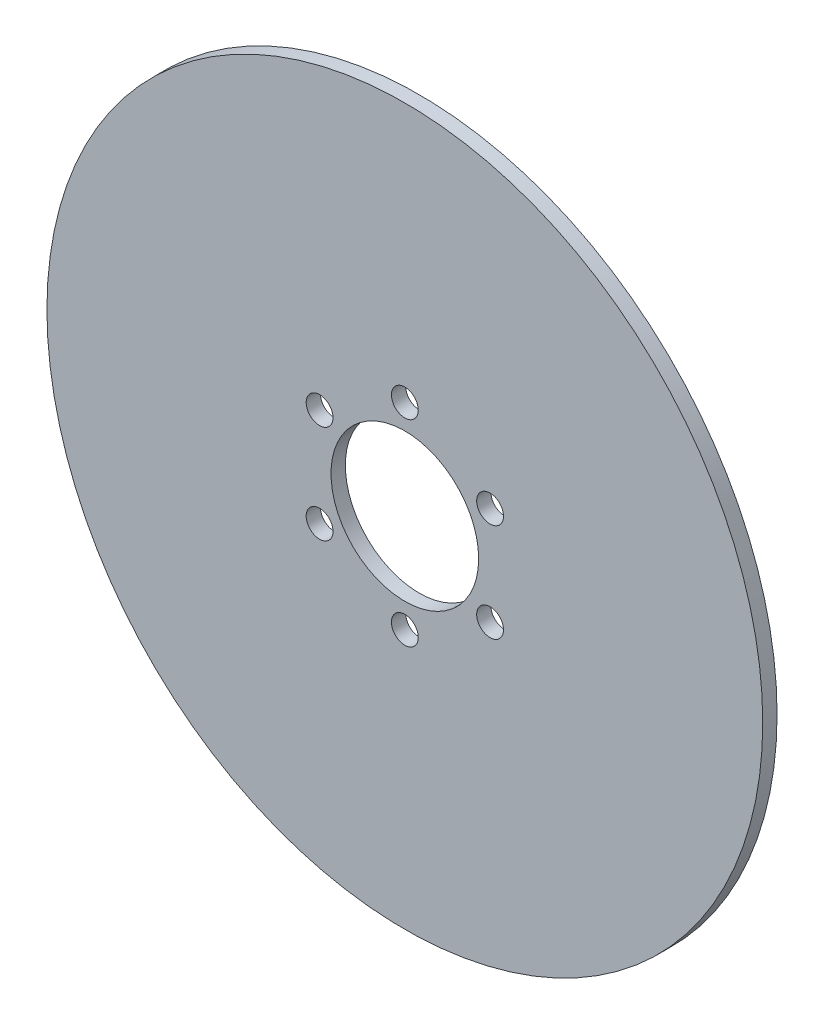
ISO-10303-21;
HEADER;
FILE_DESCRIPTION(('STEP AP214'),'2;1');
FILE_NAME('part.step','',(''),(''),'','','');
FILE_SCHEMA(('AUTOMOTIVE_DESIGN { 1 0 10303 214 1 1 1 1 }'));
ENDSEC;
DATA;
#1=APPLICATION_CONTEXT('core data for automotive mechanical design processes');
#2=APPLICATION_PROTOCOL_DEFINITION('international standard','automotive_design',2000,#1);
#3=PRODUCT_CONTEXT('',#1,'mechanical');
#4=PRODUCT('Part','Part','',(#3));
#5=PRODUCT_RELATED_PRODUCT_CATEGORY('part','',(#4));
#6=PRODUCT_DEFINITION_FORMATION('','',#4);
#7=PRODUCT_DEFINITION_CONTEXT('part definition',#1,'design');
#8=PRODUCT_DEFINITION('design','',#6,#7);
#9=PRODUCT_DEFINITION_SHAPE('','',#8);
#10=(LENGTH_UNIT() NAMED_UNIT(*) SI_UNIT(.MILLI.,.METRE.));
#11=(NAMED_UNIT(*) PLANE_ANGLE_UNIT() SI_UNIT($,.RADIAN.));
#12=(NAMED_UNIT(*) SI_UNIT($,.STERADIAN.) SOLID_ANGLE_UNIT());
#13=UNCERTAINTY_MEASURE_WITH_UNIT(LENGTH_MEASURE(1.E-05),#10,'distance_accuracy_value','');
#14=(GEOMETRIC_REPRESENTATION_CONTEXT(3) GLOBAL_UNCERTAINTY_ASSIGNED_CONTEXT((#13)) GLOBAL_UNIT_ASSIGNED_CONTEXT((#10,
#11,#12)) REPRESENTATION_CONTEXT('',''));
#15=CARTESIAN_POINT('',(0.,0.,0.));
#16=DIRECTION('',(0.,0.,1.));
#17=DIRECTION('',(1.,0.,0.));
#18=AXIS2_PLACEMENT_3D('',#15,#16,#17);
#19=CARTESIAN_POINT('',(0.,68.,3.2));
#20=DIRECTION('',(0.,0.,-1.));
#21=DIRECTION('',(-1.,0.,0.));
#22=AXIS2_PLACEMENT_3D('',#19,#20,#21);
#23=CYLINDRICAL_SURFACE('',#22,10.);
#24=CARTESIAN_POINT('',(0.,68.,0.));
#25=DIRECTION('',(0.,0.,1.));
#26=DIRECTION('',(1.,0.,0.));
#27=AXIS2_PLACEMENT_3D('',#24,#25,#26);
#28=CIRCLE('',#27,10.);
#29=CARTESIAN_POINT('',(10.,68.,0.));
#30=VERTEX_POINT('',#29);
#31=EDGE_CURVE('E85',#30,#30,#28,.T.);
#32=ORIENTED_EDGE('',*,*,#31,.F.);
#33=EDGE_LOOP('',(#32));
#34=FACE_BOUND('',#33,.T.);
#35=CARTESIAN_POINT('',(0.,68.,3.));
#36=DIRECTION('',(0.,0.,1.));
#37=DIRECTION('',(1.,0.,0.));
#38=AXIS2_PLACEMENT_3D('',#35,#36,#37);
#39=CIRCLE('',#38,10.);
#40=CARTESIAN_POINT('',(10.,68.,3.));
#41=VERTEX_POINT('',#40);
#42=EDGE_CURVE('E135',#41,#41,#39,.T.);
#43=ORIENTED_EDGE('',*,*,#42,.T.);
#44=EDGE_LOOP('',(#43));
#45=FACE_BOUND('',#44,.T.);
#46=ADVANCED_FACE('F31',(#34,#45),#23,.F.);
#47=CARTESIAN_POINT('',(26.0224734008266,62.8238082107701,3.2));
#48=DIRECTION('',(0.,0.,-1.));
#49=DIRECTION('',(-1.,0.,0.));
#50=AXIS2_PLACEMENT_3D('',#47,#48,#49);
#51=CYLINDRICAL_SURFACE('',#50,9.99999999999983);
#52=CARTESIAN_POINT('',(26.0224734008266,62.8238082107701,0.));
#53=DIRECTION('',(0.,0.,1.));
#54=DIRECTION('',(1.,0.,0.));
#55=AXIS2_PLACEMENT_3D('',#52,#53,#54);
#56=CIRCLE('',#55,9.99999999999983);
#57=CARTESIAN_POINT('',(36.0224734008264,62.8238082107701,0.));
#58=VERTEX_POINT('',#57);
#59=EDGE_CURVE('E90',#58,#58,#56,.T.);
#60=ORIENTED_EDGE('',*,*,#59,.F.);
#61=EDGE_LOOP('',(#60));
#62=FACE_BOUND('',#61,.T.);
#63=CARTESIAN_POINT('',(26.0224734008266,62.8238082107701,3.));
#64=DIRECTION('',(0.,0.,1.));
#65=DIRECTION('',(1.,0.,0.));
#66=AXIS2_PLACEMENT_3D('',#63,#64,#65);
#67=CIRCLE('',#66,9.99999999999983);
#68=CARTESIAN_POINT('',(36.0224734008264,62.8238082107701,3.));
#69=VERTEX_POINT('',#68);
#70=EDGE_CURVE('E138',#69,#69,#67,.T.);
#71=ORIENTED_EDGE('',*,*,#70,.T.);
#72=EDGE_LOOP('',(#71));
#73=FACE_BOUND('',#72,.T.);
#74=ADVANCED_FACE('F206',(#62,#73),#51,.F.);
#75=CARTESIAN_POINT('',(48.0832611206872,48.08326112069,3.2));
#76=DIRECTION('',(0.,0.,-1.));
#77=DIRECTION('',(-1.,0.,0.));
#78=AXIS2_PLACEMENT_3D('',#75,#76,#77);
#79=CYLINDRICAL_SURFACE('',#78,10.0000000000006);
#80=CARTESIAN_POINT('',(48.0832611206872,48.08326112069,0.));
#81=DIRECTION('',(0.,0.,1.));
#82=DIRECTION('',(1.,0.,0.));
#83=AXIS2_PLACEMENT_3D('',#80,#81,#82);
#84=CIRCLE('',#83,10.0000000000006);
#85=CARTESIAN_POINT('',(58.0832611206878,48.08326112069,0.));
#86=VERTEX_POINT('',#85);
#87=EDGE_CURVE('E93',#86,#86,#84,.T.);
#88=ORIENTED_EDGE('',*,*,#87,.F.);
#89=EDGE_LOOP('',(#88));
#90=FACE_BOUND('',#89,.T.);
#91=CARTESIAN_POINT('',(48.0832611206872,48.08326112069,3.));
#92=DIRECTION('',(0.,0.,1.));
#93=DIRECTION('',(1.,0.,0.));
#94=AXIS2_PLACEMENT_3D('',#91,#92,#93);
#95=CIRCLE('',#94,10.0000000000006);
#96=CARTESIAN_POINT('',(58.0832611206878,48.08326112069,3.));
#97=VERTEX_POINT('',#96);
#98=EDGE_CURVE('E141',#97,#97,#95,.T.);
#99=ORIENTED_EDGE('',*,*,#98,.T.);
#100=EDGE_LOOP('',(#99));
#101=FACE_BOUND('',#100,.T.);
#102=ADVANCED_FACE('F212',(#90,#101),#79,.F.);
#103=CARTESIAN_POINT('',(62.8238082107717,26.0224734008323,3.2));
#104=DIRECTION('',(0.,0.,-1.));
#105=DIRECTION('',(-1.,0.,0.));
#106=AXIS2_PLACEMENT_3D('',#103,#104,#105);
#107=CYLINDRICAL_SURFACE('',#106,10.0000000000023);
#108=CARTESIAN_POINT('',(62.8238082107717,26.0224734008323,0.));
#109=DIRECTION('',(0.,0.,1.));
#110=DIRECTION('',(1.,0.,0.));
#111=AXIS2_PLACEMENT_3D('',#108,#109,#110);
#112=CIRCLE('',#111,10.0000000000023);
#113=CARTESIAN_POINT('',(72.823808210774,26.0224734008323,0.));
#114=VERTEX_POINT('',#113);
#115=EDGE_CURVE('E96',#114,#114,#112,.T.);
#116=ORIENTED_EDGE('',*,*,#115,.F.);
#117=EDGE_LOOP('',(#116));
#118=FACE_BOUND('',#117,.T.);
#119=CARTESIAN_POINT('',(62.8238082107717,26.0224734008323,3.));
#120=DIRECTION('',(0.,0.,1.));
#121=DIRECTION('',(1.,0.,0.));
#122=AXIS2_PLACEMENT_3D('',#119,#120,#121);
#123=CIRCLE('',#122,10.0000000000023);
#124=CARTESIAN_POINT('',(72.823808210774,26.0224734008323,3.));
#125=VERTEX_POINT('',#124);
#126=EDGE_CURVE('E144',#125,#125,#123,.T.);
#127=ORIENTED_EDGE('',*,*,#126,.T.);
#128=EDGE_LOOP('',(#127));
#129=FACE_BOUND('',#128,.T.);
#130=ADVANCED_FACE('F345',(#118,#129),#107,.F.);
#131=CARTESIAN_POINT('',(68.0000000000068,6.75603924620195E-12,3.2));
#132=DIRECTION('',(0.,0.,-1.));
#133=DIRECTION('',(-1.,0.,0.));
#134=AXIS2_PLACEMENT_3D('',#131,#132,#133);
#135=CYLINDRICAL_SURFACE('',#134,10.0000000000047);
#136=CARTESIAN_POINT('',(68.0000000000068,6.75603924620195E-12,0.));
#137=DIRECTION('',(0.,0.,1.));
#138=DIRECTION('',(1.,0.,0.));
#139=AXIS2_PLACEMENT_3D('',#136,#137,#138);
#140=CIRCLE('',#139,10.0000000000047);
#141=CARTESIAN_POINT('',(78.0000000000115,6.75603924620195E-12,0.));
#142=VERTEX_POINT('',#141);
#143=EDGE_CURVE('E99',#142,#142,#140,.T.);
#144=ORIENTED_EDGE('',*,*,#143,.F.);
#145=EDGE_LOOP('',(#144));
#146=FACE_BOUND('',#145,.T.);
#147=CARTESIAN_POINT('',(68.0000000000068,6.75603924620195E-12,3.));
#148=DIRECTION('',(0.,0.,1.));
#149=DIRECTION('',(1.,0.,0.));
#150=AXIS2_PLACEMENT_3D('',#147,#148,#149);
#151=CIRCLE('',#150,10.0000000000047);
#152=CARTESIAN_POINT('',(78.0000000000115,6.75603924620195E-12,3.));
#153=VERTEX_POINT('',#152);
#154=EDGE_CURVE('E147',#153,#153,#151,.T.);
#155=ORIENTED_EDGE('',*,*,#154,.T.);
#156=EDGE_LOOP('',(#155));
#157=FACE_BOUND('',#156,.T.);
#158=ADVANCED_FACE('F341',(#146,#157),#135,.F.);
#159=CARTESIAN_POINT('',(62.8238082107768,-26.0224734008199,3.2));
#160=DIRECTION('',(0.,0.,-1.));
#161=DIRECTION('',(-1.,0.,0.));
#162=AXIS2_PLACEMENT_3D('',#159,#160,#161);
#163=CYLINDRICAL_SURFACE('',#162,10.0000000000074);
#164=CARTESIAN_POINT('',(62.8238082107768,-26.0224734008199,0.));
#165=DIRECTION('',(0.,0.,1.));
#166=DIRECTION('',(1.,0.,0.));
#167=AXIS2_PLACEMENT_3D('',#164,#165,#166);
#168=CIRCLE('',#167,10.0000000000074);
#169=CARTESIAN_POINT('',(72.8238082107842,-26.0224734008199,0.));
#170=VERTEX_POINT('',#169);
#171=EDGE_CURVE('E102',#170,#170,#168,.T.);
#172=ORIENTED_EDGE('',*,*,#171,.F.);
#173=EDGE_LOOP('',(#172));
#174=FACE_BOUND('',#173,.T.);
#175=CARTESIAN_POINT('',(62.8238082107768,-26.0224734008199,3.));
#176=DIRECTION('',(0.,0.,1.));
#177=DIRECTION('',(1.,0.,0.));
#178=AXIS2_PLACEMENT_3D('',#175,#176,#177);
#179=CIRCLE('',#178,10.0000000000074);
#180=CARTESIAN_POINT('',(72.8238082107842,-26.0224734008199,3.));
#181=VERTEX_POINT('',#180);
#182=EDGE_CURVE('E150',#181,#181,#179,.T.);
#183=ORIENTED_EDGE('',*,*,#182,.T.);
#184=EDGE_LOOP('',(#183));
#185=FACE_BOUND('',#184,.T.);
#186=ADVANCED_FACE('F337',(#174,#185),#163,.F.);
#187=CARTESIAN_POINT('',(48.0832611206968,-48.0832611206805,3.2));
#188=DIRECTION('',(0.,0.,-1.));
#189=DIRECTION('',(-1.,0.,0.));
#190=AXIS2_PLACEMENT_3D('',#187,#188,#189);
#191=CYLINDRICAL_SURFACE('',#190,10.00000000001);
#192=CARTESIAN_POINT('',(48.0832611206968,-48.0832611206805,0.));
#193=DIRECTION('',(0.,0.,1.));
#194=DIRECTION('',(1.,0.,0.));
#195=AXIS2_PLACEMENT_3D('',#192,#193,#194);
#196=CIRCLE('',#195,10.00000000001);
#197=CARTESIAN_POINT('',(58.0832611207067,-48.0832611206805,0.));
#198=VERTEX_POINT('',#197);
#199=EDGE_CURVE('E105',#198,#198,#196,.T.);
#200=ORIENTED_EDGE('',*,*,#199,.F.);
#201=EDGE_LOOP('',(#200));
#202=FACE_BOUND('',#201,.T.);
#203=CARTESIAN_POINT('',(48.0832611206968,-48.0832611206805,3.));
#204=DIRECTION('',(0.,0.,1.));
#205=DIRECTION('',(1.,0.,0.));
#206=AXIS2_PLACEMENT_3D('',#203,#204,#205);
#207=CIRCLE('',#206,10.00000000001);
#208=CARTESIAN_POINT('',(58.0832611207067,-48.0832611206805,3.));
#209=VERTEX_POINT('',#208);
#210=EDGE_CURVE('E153',#209,#209,#207,.T.);
#211=ORIENTED_EDGE('',*,*,#210,.T.);
#212=EDGE_LOOP('',(#211));
#213=FACE_BOUND('',#212,.T.);
#214=ADVANCED_FACE('F333',(#202,#213),#191,.F.);
#215=CARTESIAN_POINT('',(26.0224734008391,-62.8238082107649,3.2));
#216=DIRECTION('',(0.,0.,-1.));
#217=DIRECTION('',(-1.,0.,0.));
#218=AXIS2_PLACEMENT_3D('',#215,#216,#217);
#219=CYLINDRICAL_SURFACE('',#218,10.0000000000121);
#220=CARTESIAN_POINT('',(26.0224734008391,-62.8238082107649,0.));
#221=DIRECTION('',(0.,0.,1.));
#222=DIRECTION('',(1.,0.,0.));
#223=AXIS2_PLACEMENT_3D('',#220,#221,#222);
#224=CIRCLE('',#223,10.0000000000121);
#225=CARTESIAN_POINT('',(36.0224734008512,-62.8238082107649,0.));
#226=VERTEX_POINT('',#225);
#227=EDGE_CURVE('E108',#226,#226,#224,.T.);
#228=ORIENTED_EDGE('',*,*,#227,.F.);
#229=EDGE_LOOP('',(#228));
#230=FACE_BOUND('',#229,.T.);
#231=CARTESIAN_POINT('',(26.0224734008391,-62.8238082107649,3.));
#232=DIRECTION('',(0.,0.,1.));
#233=DIRECTION('',(1.,0.,0.));
#234=AXIS2_PLACEMENT_3D('',#231,#232,#233);
#235=CIRCLE('',#234,10.0000000000121);
#236=CARTESIAN_POINT('',(36.0224734008512,-62.8238082107649,3.));
#237=VERTEX_POINT('',#236);
#238=EDGE_CURVE('E156',#237,#237,#235,.T.);
#239=ORIENTED_EDGE('',*,*,#238,.T.);
#240=EDGE_LOOP('',(#239));
#241=FACE_BOUND('',#240,.T.);
#242=ADVANCED_FACE('F329',(#230,#241),#219,.F.);
#243=CARTESIAN_POINT('',(1.35120784924039E-11,-68.,3.2));
#244=DIRECTION('',(0.,0.,-1.));
#245=DIRECTION('',(-1.,0.,0.));
#246=AXIS2_PLACEMENT_3D('',#243,#244,#245);
#247=CYLINDRICAL_SURFACE('',#246,10.0000000000134);
#248=CARTESIAN_POINT('',(1.35120784924039E-11,-68.,0.));
#249=DIRECTION('',(0.,0.,1.));
#250=DIRECTION('',(1.,0.,0.));
#251=AXIS2_PLACEMENT_3D('',#248,#249,#250);
#252=CIRCLE('',#251,10.0000000000134);
#253=CARTESIAN_POINT('',(10.0000000000269,-68.,0.));
#254=VERTEX_POINT('',#253);
#255=EDGE_CURVE('E111',#254,#254,#252,.T.);
#256=ORIENTED_EDGE('',*,*,#255,.F.);
#257=EDGE_LOOP('',(#256));
#258=FACE_BOUND('',#257,.T.);
#259=CARTESIAN_POINT('',(1.35120784924039E-11,-68.,3.));
#260=DIRECTION('',(0.,0.,1.));
#261=DIRECTION('',(1.,0.,0.));
#262=AXIS2_PLACEMENT_3D('',#259,#260,#261);
#263=CIRCLE('',#262,10.0000000000134);
#264=CARTESIAN_POINT('',(10.0000000000269,-68.,3.));
#265=VERTEX_POINT('',#264);
#266=EDGE_CURVE('E159',#265,#265,#263,.T.);
#267=ORIENTED_EDGE('',*,*,#266,.T.);
#268=EDGE_LOOP('',(#267));
#269=FACE_BOUND('',#268,.T.);
#270=ADVANCED_FACE('F325',(#258,#269),#247,.F.);
#271=CARTESIAN_POINT('',(-26.0224734008131,-62.8238082107701,3.2));
#272=DIRECTION('',(0.,0.,-1.));
#273=DIRECTION('',(-1.,0.,0.));
#274=AXIS2_PLACEMENT_3D('',#271,#272,#273);
#275=CYLINDRICAL_SURFACE('',#274,10.0000000000137);
#276=CARTESIAN_POINT('',(-26.0224734008131,-62.8238082107701,0.));
#277=DIRECTION('',(0.,0.,1.));
#278=DIRECTION('',(1.,0.,0.));
#279=AXIS2_PLACEMENT_3D('',#276,#277,#278);
#280=CIRCLE('',#279,10.0000000000137);
#281=CARTESIAN_POINT('',(-16.0224734007994,-62.8238082107701,0.));
#282=VERTEX_POINT('',#281);
#283=EDGE_CURVE('E114',#282,#282,#280,.T.);
#284=ORIENTED_EDGE('',*,*,#283,.F.);
#285=EDGE_LOOP('',(#284));
#286=FACE_BOUND('',#285,.T.);
#287=CARTESIAN_POINT('',(-26.0224734008131,-62.8238082107701,3.));
#288=DIRECTION('',(0.,0.,1.));
#289=DIRECTION('',(1.,0.,0.));
#290=AXIS2_PLACEMENT_3D('',#287,#288,#289);
#291=CIRCLE('',#290,10.0000000000137);
#292=CARTESIAN_POINT('',(-16.0224734007994,-62.8238082107701,3.));
#293=VERTEX_POINT('',#292);
#294=EDGE_CURVE('E162',#293,#293,#291,.T.);
#295=ORIENTED_EDGE('',*,*,#294,.T.);
#296=EDGE_LOOP('',(#295));
#297=FACE_BOUND('',#296,.T.);
#298=ADVANCED_FACE('F321',(#286,#297),#275,.F.);
#299=CARTESIAN_POINT('',(-48.0832611206737,-48.08326112069,3.2));
#300=DIRECTION('',(0.,0.,-1.));
#301=DIRECTION('',(-1.,0.,0.));
#302=AXIS2_PLACEMENT_3D('',#299,#300,#301);
#303=CYLINDRICAL_SURFACE('',#302,10.000000000013);
#304=CARTESIAN_POINT('',(-48.0832611206737,-48.08326112069,0.));
#305=DIRECTION('',(0.,0.,1.));
#306=DIRECTION('',(1.,0.,0.));
#307=AXIS2_PLACEMENT_3D('',#304,#305,#306);
#308=CIRCLE('',#307,10.000000000013);
#309=CARTESIAN_POINT('',(-38.0832611206607,-48.08326112069,0.));
#310=VERTEX_POINT('',#309);
#311=EDGE_CURVE('E117',#310,#310,#308,.T.);
#312=ORIENTED_EDGE('',*,*,#311,.F.);
#313=EDGE_LOOP('',(#312));
#314=FACE_BOUND('',#313,.T.);
#315=CARTESIAN_POINT('',(-48.0832611206737,-48.08326112069,3.));
#316=DIRECTION('',(0.,0.,1.));
#317=DIRECTION('',(1.,0.,0.));
#318=AXIS2_PLACEMENT_3D('',#315,#316,#317);
#319=CIRCLE('',#318,10.000000000013);
#320=CARTESIAN_POINT('',(-38.0832611206607,-48.08326112069,3.));
#321=VERTEX_POINT('',#320);
#322=EDGE_CURVE('E165',#321,#321,#319,.T.);
#323=ORIENTED_EDGE('',*,*,#322,.T.);
#324=EDGE_LOOP('',(#323));
#325=FACE_BOUND('',#324,.T.);
#326=ADVANCED_FACE('F317',(#314,#325),#303,.F.);
#327=CARTESIAN_POINT('',(-62.8238082107581,-26.0224734008324,3.2));
#328=DIRECTION('',(0.,0.,-1.));
#329=DIRECTION('',(-1.,0.,0.));
#330=AXIS2_PLACEMENT_3D('',#327,#328,#329);
#331=CYLINDRICAL_SURFACE('',#330,10.0000000000115);
#332=CARTESIAN_POINT('',(-62.8238082107581,-26.0224734008324,0.));
#333=DIRECTION('',(0.,0.,1.));
#334=DIRECTION('',(1.,0.,0.));
#335=AXIS2_PLACEMENT_3D('',#332,#333,#334);
#336=CIRCLE('',#335,10.0000000000115);
#337=CARTESIAN_POINT('',(-52.8238082107467,-26.0224734008324,0.));
#338=VERTEX_POINT('',#337);
#339=EDGE_CURVE('E120',#338,#338,#336,.T.);
#340=ORIENTED_EDGE('',*,*,#339,.F.);
#341=EDGE_LOOP('',(#340));
#342=FACE_BOUND('',#341,.T.);
#343=CARTESIAN_POINT('',(-62.8238082107581,-26.0224734008324,3.));
#344=DIRECTION('',(0.,0.,1.));
#345=DIRECTION('',(1.,0.,0.));
#346=AXIS2_PLACEMENT_3D('',#343,#344,#345);
#347=CIRCLE('',#346,10.0000000000115);
#348=CARTESIAN_POINT('',(-52.8238082107467,-26.0224734008324,3.));
#349=VERTEX_POINT('',#348);
#350=EDGE_CURVE('E168',#349,#349,#347,.T.);
#351=ORIENTED_EDGE('',*,*,#350,.T.);
#352=EDGE_LOOP('',(#351));
#353=FACE_BOUND('',#352,.T.);
#354=ADVANCED_FACE('F313',(#342,#353),#331,.F.);
#355=CARTESIAN_POINT('',(-67.9999999999932,-6.76436684443615E-12,3.2));
#356=DIRECTION('',(0.,0.,-1.));
#357=DIRECTION('',(-1.,0.,0.));
#358=AXIS2_PLACEMENT_3D('',#355,#356,#357);
#359=CYLINDRICAL_SURFACE('',#358,10.0000000000091);
#360=CARTESIAN_POINT('',(-67.9999999999932,-6.76436684443615E-12,0.));
#361=DIRECTION('',(0.,0.,1.));
#362=DIRECTION('',(1.,0.,0.));
#363=AXIS2_PLACEMENT_3D('',#360,#361,#362);
#364=CIRCLE('',#363,10.0000000000091);
#365=CARTESIAN_POINT('',(-57.9999999999841,-6.76436684443615E-12,0.));
#366=VERTEX_POINT('',#365);
#367=EDGE_CURVE('E123',#366,#366,#364,.T.);
#368=ORIENTED_EDGE('',*,*,#367,.F.);
#369=EDGE_LOOP('',(#368));
#370=FACE_BOUND('',#369,.T.);
#371=CARTESIAN_POINT('',(-67.9999999999932,-6.76436684443615E-12,3.));
#372=DIRECTION('',(0.,0.,1.));
#373=DIRECTION('',(1.,0.,0.));
#374=AXIS2_PLACEMENT_3D('',#371,#372,#373);
#375=CIRCLE('',#374,10.0000000000091);
#376=CARTESIAN_POINT('',(-57.9999999999841,-6.76436684443615E-12,3.));
#377=VERTEX_POINT('',#376);
#378=EDGE_CURVE('E171',#377,#377,#375,.T.);
#379=ORIENTED_EDGE('',*,*,#378,.T.);
#380=EDGE_LOOP('',(#379));
#381=FACE_BOUND('',#380,.T.);
#382=ADVANCED_FACE('F309',(#370,#381),#359,.F.);
#383=CARTESIAN_POINT('',(-62.8238082107633,26.0224734008199,3.2));
#384=DIRECTION('',(0.,0.,-1.));
#385=DIRECTION('',(-1.,0.,0.));
#386=AXIS2_PLACEMENT_3D('',#383,#384,#385);
#387=CYLINDRICAL_SURFACE('',#386,10.0000000000065);
#388=CARTESIAN_POINT('',(-62.8238082107633,26.0224734008199,0.));
#389=DIRECTION('',(0.,0.,1.));
#390=DIRECTION('',(1.,0.,0.));
#391=AXIS2_PLACEMENT_3D('',#388,#389,#390);
#392=CIRCLE('',#391,10.0000000000065);
#393=CARTESIAN_POINT('',(-52.8238082107569,26.0224734008199,0.));
#394=VERTEX_POINT('',#393);
#395=EDGE_CURVE('E126',#394,#394,#392,.T.);
#396=ORIENTED_EDGE('',*,*,#395,.F.);
#397=EDGE_LOOP('',(#396));
#398=FACE_BOUND('',#397,.T.);
#399=CARTESIAN_POINT('',(-62.8238082107633,26.0224734008199,3.));
#400=DIRECTION('',(0.,0.,1.));
#401=DIRECTION('',(1.,0.,0.));
#402=AXIS2_PLACEMENT_3D('',#399,#400,#401);
#403=CIRCLE('',#402,10.0000000000065);
#404=CARTESIAN_POINT('',(-52.8238082107569,26.0224734008199,3.));
#405=VERTEX_POINT('',#404);
#406=EDGE_CURVE('E174',#405,#405,#403,.T.);
#407=ORIENTED_EDGE('',*,*,#406,.T.);
#408=EDGE_LOOP('',(#407));
#409=FACE_BOUND('',#408,.T.);
#410=ADVANCED_FACE('F303',(#398,#409),#387,.F.);
#411=CARTESIAN_POINT('',(-48.0832611206833,48.0832611206804,3.2));
#412=DIRECTION('',(0.,0.,-1.));
#413=DIRECTION('',(-1.,0.,0.));
#414=AXIS2_PLACEMENT_3D('',#411,#412,#413);
#415=CYLINDRICAL_SURFACE('',#414,10.0000000000041);
#416=CARTESIAN_POINT('',(-48.0832611206833,48.0832611206804,0.));
#417=DIRECTION('',(0.,0.,1.));
#418=DIRECTION('',(1.,0.,0.));
#419=AXIS2_PLACEMENT_3D('',#416,#417,#418);
#420=CIRCLE('',#419,10.0000000000041);
#421=CARTESIAN_POINT('',(-38.0832611206792,48.0832611206804,0.));
#422=VERTEX_POINT('',#421);
#423=EDGE_CURVE('E129',#422,#422,#420,.T.);
#424=ORIENTED_EDGE('',*,*,#423,.F.);
#425=EDGE_LOOP('',(#424));
#426=FACE_BOUND('',#425,.T.);
#427=CARTESIAN_POINT('',(-48.0832611206833,48.0832611206804,3.));
#428=DIRECTION('',(0.,0.,1.));
#429=DIRECTION('',(1.,0.,0.));
#430=AXIS2_PLACEMENT_3D('',#427,#428,#429);
#431=CIRCLE('',#430,10.0000000000041);
#432=CARTESIAN_POINT('',(-38.0832611206792,48.0832611206804,3.));
#433=VERTEX_POINT('',#432);
#434=EDGE_CURVE('E177',#433,#433,#431,.T.);
#435=ORIENTED_EDGE('',*,*,#434,.T.);
#436=EDGE_LOOP('',(#435));
#437=FACE_BOUND('',#436,.T.);
#438=ADVANCED_FACE('F299',(#426,#437),#415,.F.);
#439=CARTESIAN_POINT('',(-26.0224734008256,62.8238082107649,3.2));
#440=DIRECTION('',(0.,0.,-1.));
#441=DIRECTION('',(-1.,0.,0.));
#442=AXIS2_PLACEMENT_3D('',#439,#440,#441);
#443=CYLINDRICAL_SURFACE('',#442,10.0000000000022);
#444=CARTESIAN_POINT('',(-26.0224734008256,62.8238082107649,0.));
#445=DIRECTION('',(0.,0.,1.));
#446=DIRECTION('',(1.,0.,0.));
#447=AXIS2_PLACEMENT_3D('',#444,#445,#446);
#448=CIRCLE('',#447,10.0000000000022);
#449=CARTESIAN_POINT('',(-16.0224734008235,62.8238082107649,0.));
#450=VERTEX_POINT('',#449);
#451=EDGE_CURVE('E132',#450,#450,#448,.T.);
#452=ORIENTED_EDGE('',*,*,#451,.F.);
#453=EDGE_LOOP('',(#452));
#454=FACE_BOUND('',#453,.T.);
#455=CARTESIAN_POINT('',(-26.0224734008256,62.8238082107649,3.));
#456=DIRECTION('',(0.,0.,1.));
#457=DIRECTION('',(1.,0.,0.));
#458=AXIS2_PLACEMENT_3D('',#455,#456,#457);
#459=CIRCLE('',#458,10.0000000000022);
#460=CARTESIAN_POINT('',(-16.0224734008235,62.8238082107649,3.));
#461=VERTEX_POINT('',#460);
#462=EDGE_CURVE('E35',#461,#461,#459,.T.);
#463=ORIENTED_EDGE('',*,*,#462,.T.);
#464=EDGE_LOOP('',(#463));
#465=FACE_BOUND('',#464,.T.);
#466=ADVANCED_FACE('F184',(#454,#465),#443,.F.);
#467=CARTESIAN_POINT('',(0.,0.,3.2));
#468=DIRECTION('',(0.,0.,1.));
#469=DIRECTION('',(1.,0.,0.));
#470=AXIS2_PLACEMENT_3D('',#467,#468,#469);
#471=PLANE('',#470);
#472=CARTESIAN_POINT('',(0.,0.,3.2));
#473=DIRECTION('',(0.,0.,1.));
#474=DIRECTION('',(1.,0.,0.));
#475=AXIS2_PLACEMENT_3D('',#472,#473,#474);
#476=CIRCLE('',#475,80.);
#477=CARTESIAN_POINT('',(80.,0.,3.2));
#478=VERTEX_POINT('',#477);
#479=EDGE_CURVE('E10',#478,#478,#476,.T.);
#480=ORIENTED_EDGE('',*,*,#479,.T.);
#481=EDGE_LOOP('',(#480));
#482=FACE_BOUND('',#481,.T.);
#483=CARTESIAN_POINT('',(-19.0525588832572,10.9999999999992,3.2));
#484=DIRECTION('',(0.,0.,1.));
#485=DIRECTION('',(1.,0.,0.));
#486=AXIS2_PLACEMENT_3D('',#483,#484,#485);
#487=CIRCLE('',#486,3.00000000000094);
#488=CARTESIAN_POINT('',(-16.0525588832562,10.9999999999992,3.2));
#489=VERTEX_POINT('',#488);
#490=EDGE_CURVE('E79',#489,#489,#487,.T.);
#491=ORIENTED_EDGE('',*,*,#490,.F.);
#492=EDGE_LOOP('',(#491));
#493=FACE_BOUND('',#492,.T.);
#494=CARTESIAN_POINT('',(1.87044437649042E-12,-22.,3.2));
#495=DIRECTION('',(0.,0.,1.));
#496=DIRECTION('',(1.,0.,0.));
#497=AXIS2_PLACEMENT_3D('',#494,#495,#496);
#498=CIRCLE('',#497,3.00000000000194);
#499=CARTESIAN_POINT('',(3.00000000000381,-22.,3.2));
#500=VERTEX_POINT('',#499);
#501=EDGE_CURVE('E67',#500,#500,#498,.T.);
#502=ORIENTED_EDGE('',*,*,#501,.F.);
#503=EDGE_LOOP('',(#502));
#504=FACE_BOUND('',#503,.T.);
#505=CARTESIAN_POINT('',(19.0525588832581,11.0000000000008,3.2));
#506=DIRECTION('',(0.,0.,1.));
#507=DIRECTION('',(1.,0.,0.));
#508=AXIS2_PLACEMENT_3D('',#505,#506,#507);
#509=CIRCLE('',#508,3.00000000000026);
#510=CARTESIAN_POINT('',(22.0525588832584,11.0000000000008,3.2));
#511=VERTEX_POINT('',#510);
#512=EDGE_CURVE('E55',#511,#511,#509,.T.);
#513=ORIENTED_EDGE('',*,*,#512,.F.);
#514=EDGE_LOOP('',(#513));
#515=FACE_BOUND('',#514,.T.);
#516=CARTESIAN_POINT('',(0.,22.,3.2));
#517=DIRECTION('',(0.,0.,1.));
#518=DIRECTION('',(1.,0.,0.));
#519=AXIS2_PLACEMENT_3D('',#516,#517,#518);
#520=CIRCLE('',#519,3.);
#521=CARTESIAN_POINT('',(3.,22.,3.2));
#522=VERTEX_POINT('',#521);
#523=EDGE_CURVE('E44',#522,#522,#520,.T.);
#524=ORIENTED_EDGE('',*,*,#523,.F.);
#525=EDGE_LOOP('',(#524));
#526=FACE_BOUND('',#525,.T.);
#527=CARTESIAN_POINT('',(0.,0.,3.2));
#528=DIRECTION('',(0.,0.,1.));
#529=DIRECTION('',(1.,0.,0.));
#530=AXIS2_PLACEMENT_3D('',#527,#528,#529);
#531=CIRCLE('',#530,16.5);
#532=CARTESIAN_POINT('',(16.5,0.,3.2));
#533=VERTEX_POINT('',#532);
#534=EDGE_CURVE('E49',#533,#533,#531,.T.);
#535=ORIENTED_EDGE('',*,*,#534,.F.);
#536=EDGE_LOOP('',(#535));
#537=FACE_BOUND('',#536,.T.);
#538=CARTESIAN_POINT('',(19.0525588832591,-10.9999999999992,3.2));
#539=DIRECTION('',(0.,0.,1.));
#540=DIRECTION('',(1.,0.,0.));
#541=AXIS2_PLACEMENT_3D('',#538,#539,#540);
#542=CIRCLE('',#541,3.00000000000121);
#543=CARTESIAN_POINT('',(22.0525588832603,-10.9999999999992,3.2));
#544=VERTEX_POINT('',#543);
#545=EDGE_CURVE('E61',#544,#544,#542,.T.);
#546=ORIENTED_EDGE('',*,*,#545,.F.);
#547=EDGE_LOOP('',(#546));
#548=FACE_BOUND('',#547,.T.);
#549=CARTESIAN_POINT('',(-19.0525588832562,-11.0000000000008,3.2));
#550=DIRECTION('',(0.,0.,1.));
#551=DIRECTION('',(1.,0.,0.));
#552=AXIS2_PLACEMENT_3D('',#549,#550,#551);
#553=CIRCLE('',#552,3.00000000000178);
#554=CARTESIAN_POINT('',(-16.0525588832545,-11.0000000000008,3.2));
#555=VERTEX_POINT('',#554);
#556=EDGE_CURVE('E73',#555,#555,#553,.T.);
#557=ORIENTED_EDGE('',*,*,#556,.F.);
#558=EDGE_LOOP('',(#557));
#559=FACE_BOUND('',#558,.T.);
#560=ADVANCED_FACE('F242',(#482,#493,#504,#515,#526,#537,#548,#559),#471,.T.);
#561=CARTESIAN_POINT('',(0.,0.,0.));
#562=DIRECTION('',(0.,0.,1.));
#563=DIRECTION('',(1.,0.,0.));
#564=AXIS2_PLACEMENT_3D('',#561,#562,#563);
#565=PLANE('',#564);
#566=CARTESIAN_POINT('',(0.,0.,0.));
#567=DIRECTION('',(0.,0.,1.));
#568=DIRECTION('',(1.,0.,0.));
#569=AXIS2_PLACEMENT_3D('',#566,#567,#568);
#570=CIRCLE('',#569,80.);
#571=CARTESIAN_POINT('',(80.,0.,0.));
#572=VERTEX_POINT('',#571);
#573=EDGE_CURVE('E39',#572,#572,#570,.T.);
#574=ORIENTED_EDGE('',*,*,#573,.F.);
#575=EDGE_LOOP('',(#574));
#576=FACE_BOUND('',#575,.T.);
#577=CARTESIAN_POINT('',(0.,22.,0.));
#578=DIRECTION('',(0.,0.,1.));
#579=DIRECTION('',(1.,0.,0.));
#580=AXIS2_PLACEMENT_3D('',#577,#578,#579);
#581=CIRCLE('',#580,3.);
#582=CARTESIAN_POINT('',(3.,22.,0.));
#583=VERTEX_POINT('',#582);
#584=EDGE_CURVE('E46',#583,#583,#581,.T.);
#585=ORIENTED_EDGE('',*,*,#584,.T.);
#586=EDGE_LOOP('',(#585));
#587=FACE_BOUND('',#586,.T.);
#588=CARTESIAN_POINT('',(0.,0.,0.));
#589=DIRECTION('',(0.,0.,1.));
#590=DIRECTION('',(1.,0.,0.));
#591=AXIS2_PLACEMENT_3D('',#588,#589,#590);
#592=CIRCLE('',#591,16.5);
#593=CARTESIAN_POINT('',(16.5,0.,0.));
#594=VERTEX_POINT('',#593);
#595=EDGE_CURVE('E52',#594,#594,#592,.T.);
#596=ORIENTED_EDGE('',*,*,#595,.T.);
#597=EDGE_LOOP('',(#596));
#598=FACE_BOUND('',#597,.T.);
#599=CARTESIAN_POINT('',(19.0525588832581,11.0000000000008,0.));
#600=DIRECTION('',(0.,0.,1.));
#601=DIRECTION('',(1.,0.,0.));
#602=AXIS2_PLACEMENT_3D('',#599,#600,#601);
#603=CIRCLE('',#602,3.00000000000026);
#604=CARTESIAN_POINT('',(22.0525588832584,11.0000000000008,0.));
#605=VERTEX_POINT('',#604);
#606=EDGE_CURVE('E58',#605,#605,#603,.T.);
#607=ORIENTED_EDGE('',*,*,#606,.T.);
#608=EDGE_LOOP('',(#607));
#609=FACE_BOUND('',#608,.T.);
#610=CARTESIAN_POINT('',(19.0525588832591,-10.9999999999992,0.));
#611=DIRECTION('',(0.,0.,1.));
#612=DIRECTION('',(1.,0.,0.));
#613=AXIS2_PLACEMENT_3D('',#610,#611,#612);
#614=CIRCLE('',#613,3.00000000000121);
#615=CARTESIAN_POINT('',(22.0525588832603,-10.9999999999992,0.));
#616=VERTEX_POINT('',#615);
#617=EDGE_CURVE('E64',#616,#616,#614,.T.);
#618=ORIENTED_EDGE('',*,*,#617,.T.);
#619=EDGE_LOOP('',(#618));
#620=FACE_BOUND('',#619,.T.);
#621=CARTESIAN_POINT('',(1.87044437649042E-12,-22.,0.));
#622=DIRECTION('',(0.,0.,1.));
#623=DIRECTION('',(1.,0.,0.));
#624=AXIS2_PLACEMENT_3D('',#621,#622,#623);
#625=CIRCLE('',#624,3.00000000000194);
#626=CARTESIAN_POINT('',(3.00000000000381,-22.,0.));
#627=VERTEX_POINT('',#626);
#628=EDGE_CURVE('E70',#627,#627,#625,.T.);
#629=ORIENTED_EDGE('',*,*,#628,.T.);
#630=EDGE_LOOP('',(#629));
#631=FACE_BOUND('',#630,.T.);
#632=CARTESIAN_POINT('',(-19.0525588832562,-11.0000000000008,0.));
#633=DIRECTION('',(0.,0.,1.));
#634=DIRECTION('',(1.,0.,0.));
#635=AXIS2_PLACEMENT_3D('',#632,#633,#634);
#636=CIRCLE('',#635,3.00000000000178);
#637=CARTESIAN_POINT('',(-16.0525588832545,-11.0000000000008,0.));
#638=VERTEX_POINT('',#637);
#639=EDGE_CURVE('E76',#638,#638,#636,.T.);
#640=ORIENTED_EDGE('',*,*,#639,.T.);
#641=EDGE_LOOP('',(#640));
#642=FACE_BOUND('',#641,.T.);
#643=CARTESIAN_POINT('',(-19.0525588832572,10.9999999999992,0.));
#644=DIRECTION('',(0.,0.,1.));
#645=DIRECTION('',(1.,0.,0.));
#646=AXIS2_PLACEMENT_3D('',#643,#644,#645);
#647=CIRCLE('',#646,3.00000000000094);
#648=CARTESIAN_POINT('',(-16.0525588832562,10.9999999999992,0.));
#649=VERTEX_POINT('',#648);
#650=EDGE_CURVE('E82',#649,#649,#647,.T.);
#651=ORIENTED_EDGE('',*,*,#650,.T.);
#652=EDGE_LOOP('',(#651));
#653=FACE_BOUND('',#652,.T.);
#654=ORIENTED_EDGE('',*,*,#31,.T.);
#655=EDGE_LOOP('',(#654));
#656=FACE_BOUND('',#655,.T.);
#657=ORIENTED_EDGE('',*,*,#59,.T.);
#658=EDGE_LOOP('',(#657));
#659=FACE_BOUND('',#658,.T.);
#660=ORIENTED_EDGE('',*,*,#87,.T.);
#661=EDGE_LOOP('',(#660));
#662=FACE_BOUND('',#661,.T.);
#663=ORIENTED_EDGE('',*,*,#115,.T.);
#664=EDGE_LOOP('',(#663));
#665=FACE_BOUND('',#664,.T.);
#666=ORIENTED_EDGE('',*,*,#143,.T.);
#667=EDGE_LOOP('',(#666));
#668=FACE_BOUND('',#667,.T.);
#669=ORIENTED_EDGE('',*,*,#171,.T.);
#670=EDGE_LOOP('',(#669));
#671=FACE_BOUND('',#670,.T.);
#672=ORIENTED_EDGE('',*,*,#199,.T.);
#673=EDGE_LOOP('',(#672));
#674=FACE_BOUND('',#673,.T.);
#675=ORIENTED_EDGE('',*,*,#227,.T.);
#676=EDGE_LOOP('',(#675));
#677=FACE_BOUND('',#676,.T.);
#678=ORIENTED_EDGE('',*,*,#255,.T.);
#679=EDGE_LOOP('',(#678));
#680=FACE_BOUND('',#679,.T.);
#681=ORIENTED_EDGE('',*,*,#283,.T.);
#682=EDGE_LOOP('',(#681));
#683=FACE_BOUND('',#682,.T.);
#684=ORIENTED_EDGE('',*,*,#311,.T.);
#685=EDGE_LOOP('',(#684));
#686=FACE_BOUND('',#685,.T.);
#687=ORIENTED_EDGE('',*,*,#339,.T.);
#688=EDGE_LOOP('',(#687));
#689=FACE_BOUND('',#688,.T.);
#690=ORIENTED_EDGE('',*,*,#367,.T.);
#691=EDGE_LOOP('',(#690));
#692=FACE_BOUND('',#691,.T.);
#693=ORIENTED_EDGE('',*,*,#395,.T.);
#694=EDGE_LOOP('',(#693));
#695=FACE_BOUND('',#694,.T.);
#696=ORIENTED_EDGE('',*,*,#423,.T.);
#697=EDGE_LOOP('',(#696));
#698=FACE_BOUND('',#697,.T.);
#699=ORIENTED_EDGE('',*,*,#451,.T.);
#700=EDGE_LOOP('',(#699));
#701=FACE_BOUND('',#700,.T.);
#702=ADVANCED_FACE('F244',(#576,#587,#598,#609,#620,#631,#642,#653,#656,#659,#662,#665,#668,
#671,#674,#677,#680,#683,#686,#689,#692,#695,#698,#701),#565,.F.);
#703=CARTESIAN_POINT('',(0.,0.,3.2));
#704=DIRECTION('',(0.,0.,-1.));
#705=DIRECTION('',(-1.,0.,0.));
#706=AXIS2_PLACEMENT_3D('',#703,#704,#705);
#707=CYLINDRICAL_SURFACE('',#706,80.);
#708=ORIENTED_EDGE('',*,*,#479,.F.);
#709=EDGE_LOOP('',(#708));
#710=FACE_BOUND('',#709,.T.);
#711=ORIENTED_EDGE('',*,*,#573,.T.);
#712=EDGE_LOOP('',(#711));
#713=FACE_BOUND('',#712,.T.);
#714=ADVANCED_FACE('F33',(#710,#713),#707,.T.);
#715=CARTESIAN_POINT('',(0.,22.,3.2));
#716=DIRECTION('',(0.,0.,-1.));
#717=DIRECTION('',(-1.,0.,0.));
#718=AXIS2_PLACEMENT_3D('',#715,#716,#717);
#719=CYLINDRICAL_SURFACE('',#718,3.);
#720=ORIENTED_EDGE('',*,*,#523,.T.);
#721=EDGE_LOOP('',(#720));
#722=FACE_BOUND('',#721,.T.);
#723=ORIENTED_EDGE('',*,*,#584,.F.);
#724=EDGE_LOOP('',(#723));
#725=FACE_BOUND('',#724,.T.);
#726=ADVANCED_FACE('F237',(#722,#725),#719,.F.);
#727=CARTESIAN_POINT('',(0.,0.,3.2));
#728=DIRECTION('',(0.,0.,-1.));
#729=DIRECTION('',(-1.,0.,0.));
#730=AXIS2_PLACEMENT_3D('',#727,#728,#729);
#731=CYLINDRICAL_SURFACE('',#730,16.5);
#732=ORIENTED_EDGE('',*,*,#534,.T.);
#733=EDGE_LOOP('',(#732));
#734=FACE_BOUND('',#733,.T.);
#735=ORIENTED_EDGE('',*,*,#595,.F.);
#736=EDGE_LOOP('',(#735));
#737=FACE_BOUND('',#736,.T.);
#738=ADVANCED_FACE('F233',(#734,#737),#731,.F.);
#739=CARTESIAN_POINT('',(19.0525588832581,11.0000000000008,3.2));
#740=DIRECTION('',(0.,0.,-1.));
#741=DIRECTION('',(-1.,0.,0.));
#742=AXIS2_PLACEMENT_3D('',#739,#740,#741);
#743=CYLINDRICAL_SURFACE('',#742,3.00000000000026);
#744=ORIENTED_EDGE('',*,*,#512,.T.);
#745=EDGE_LOOP('',(#744));
#746=FACE_BOUND('',#745,.T.);
#747=ORIENTED_EDGE('',*,*,#606,.F.);
#748=EDGE_LOOP('',(#747));
#749=FACE_BOUND('',#748,.T.);
#750=ADVANCED_FACE('F229',(#746,#749),#743,.F.);
#751=CARTESIAN_POINT('',(19.0525588832591,-10.9999999999992,3.2));
#752=DIRECTION('',(0.,0.,-1.));
#753=DIRECTION('',(-1.,0.,0.));
#754=AXIS2_PLACEMENT_3D('',#751,#752,#753);
#755=CYLINDRICAL_SURFACE('',#754,3.00000000000121);
#756=ORIENTED_EDGE('',*,*,#545,.T.);
#757=EDGE_LOOP('',(#756));
#758=FACE_BOUND('',#757,.T.);
#759=ORIENTED_EDGE('',*,*,#617,.F.);
#760=EDGE_LOOP('',(#759));
#761=FACE_BOUND('',#760,.T.);
#762=ADVANCED_FACE('F225',(#758,#761),#755,.F.);
#763=CARTESIAN_POINT('',(1.87044437649042E-12,-22.,3.2));
#764=DIRECTION('',(0.,0.,-1.));
#765=DIRECTION('',(-1.,0.,0.));
#766=AXIS2_PLACEMENT_3D('',#763,#764,#765);
#767=CYLINDRICAL_SURFACE('',#766,3.00000000000194);
#768=ORIENTED_EDGE('',*,*,#501,.T.);
#769=EDGE_LOOP('',(#768));
#770=FACE_BOUND('',#769,.T.);
#771=ORIENTED_EDGE('',*,*,#628,.F.);
#772=EDGE_LOOP('',(#771));
#773=FACE_BOUND('',#772,.T.);
#774=ADVANCED_FACE('F221',(#770,#773),#767,.F.);
#775=CARTESIAN_POINT('',(-19.0525588832562,-11.0000000000008,3.2));
#776=DIRECTION('',(0.,0.,-1.));
#777=DIRECTION('',(-1.,0.,0.));
#778=AXIS2_PLACEMENT_3D('',#775,#776,#777);
#779=CYLINDRICAL_SURFACE('',#778,3.00000000000178);
#780=ORIENTED_EDGE('',*,*,#556,.T.);
#781=EDGE_LOOP('',(#780));
#782=FACE_BOUND('',#781,.T.);
#783=ORIENTED_EDGE('',*,*,#639,.F.);
#784=EDGE_LOOP('',(#783));
#785=FACE_BOUND('',#784,.T.);
#786=ADVANCED_FACE('F198',(#782,#785),#779,.F.);
#787=CARTESIAN_POINT('',(-19.0525588832572,10.9999999999992,3.2));
#788=DIRECTION('',(0.,0.,-1.));
#789=DIRECTION('',(-1.,0.,0.));
#790=AXIS2_PLACEMENT_3D('',#787,#788,#789);
#791=CYLINDRICAL_SURFACE('',#790,3.00000000000094);
#792=ORIENTED_EDGE('',*,*,#490,.T.);
#793=EDGE_LOOP('',(#792));
#794=FACE_BOUND('',#793,.T.);
#795=ORIENTED_EDGE('',*,*,#650,.F.);
#796=EDGE_LOOP('',(#795));
#797=FACE_BOUND('',#796,.T.);
#798=ADVANCED_FACE('F189',(#794,#797),#791,.F.);
#799=CARTESIAN_POINT('',(0.,0.,3.));
#800=DIRECTION('',(0.,0.,1.));
#801=DIRECTION('',(1.,0.,0.));
#802=AXIS2_PLACEMENT_3D('',#799,#800,#801);
#803=PLANE('',#802);
#804=ORIENTED_EDGE('',*,*,#462,.F.);
#805=EDGE_LOOP('',(#804));
#806=FACE_BOUND('',#805,.T.);
#807=ADVANCED_FACE('F186',(#806),#803,.F.);
#808=ORIENTED_EDGE('',*,*,#434,.F.);
#809=EDGE_LOOP('',(#808));
#810=FACE_BOUND('',#809,.T.);
#811=ADVANCED_FACE('F188',(#810),#803,.F.);
#812=ORIENTED_EDGE('',*,*,#406,.F.);
#813=EDGE_LOOP('',(#812));
#814=FACE_BOUND('',#813,.T.);
#815=ADVANCED_FACE('F196',(#814),#803,.F.);
#816=ORIENTED_EDGE('',*,*,#378,.F.);
#817=EDGE_LOOP('',(#816));
#818=FACE_BOUND('',#817,.T.);
#819=ADVANCED_FACE('F418',(#818),#803,.F.);
#820=ORIENTED_EDGE('',*,*,#350,.F.);
#821=EDGE_LOOP('',(#820));
#822=FACE_BOUND('',#821,.T.);
#823=ADVANCED_FACE('F411',(#822),#803,.F.);
#824=ORIENTED_EDGE('',*,*,#322,.F.);
#825=EDGE_LOOP('',(#824));
#826=FACE_BOUND('',#825,.T.);
#827=ADVANCED_FACE('F404',(#826),#803,.F.);
#828=ORIENTED_EDGE('',*,*,#294,.F.);
#829=EDGE_LOOP('',(#828));
#830=FACE_BOUND('',#829,.T.);
#831=ADVANCED_FACE('F397',(#830),#803,.F.);
#832=ORIENTED_EDGE('',*,*,#266,.F.);
#833=EDGE_LOOP('',(#832));
#834=FACE_BOUND('',#833,.T.);
#835=ADVANCED_FACE('F390',(#834),#803,.F.);
#836=ORIENTED_EDGE('',*,*,#238,.F.);
#837=EDGE_LOOP('',(#836));
#838=FACE_BOUND('',#837,.T.);
#839=ADVANCED_FACE('F383',(#838),#803,.F.);
#840=ORIENTED_EDGE('',*,*,#210,.F.);
#841=EDGE_LOOP('',(#840));
#842=FACE_BOUND('',#841,.T.);
#843=ADVANCED_FACE('F376',(#842),#803,.F.);
#844=ORIENTED_EDGE('',*,*,#182,.F.);
#845=EDGE_LOOP('',(#844));
#846=FACE_BOUND('',#845,.T.);
#847=ADVANCED_FACE('F369',(#846),#803,.F.);
#848=ORIENTED_EDGE('',*,*,#154,.F.);
#849=EDGE_LOOP('',(#848));
#850=FACE_BOUND('',#849,.T.);
#851=ADVANCED_FACE('F364',(#850),#803,.F.);
#852=ORIENTED_EDGE('',*,*,#126,.F.);
#853=EDGE_LOOP('',(#852));
#854=FACE_BOUND('',#853,.T.);
#855=ADVANCED_FACE('F358',(#854),#803,.F.);
#856=ORIENTED_EDGE('',*,*,#98,.F.);
#857=EDGE_LOOP('',(#856));
#858=FACE_BOUND('',#857,.T.);
#859=ADVANCED_FACE('F356',(#858),#803,.F.);
#860=ORIENTED_EDGE('',*,*,#70,.F.);
#861=EDGE_LOOP('',(#860));
#862=FACE_BOUND('',#861,.T.);
#863=ADVANCED_FACE('F203',(#862),#803,.F.);
#864=ORIENTED_EDGE('',*,*,#42,.F.);
#865=EDGE_LOOP('',(#864));
#866=FACE_BOUND('',#865,.T.);
#867=ADVANCED_FACE('F191',(#866),#803,.F.);
#868=CLOSED_SHELL('',(#46,#74,#102,#130,#158,#186,#214,#242,#270,#298,#326,#354,#382,#410,#438,
#466,#560,#702,#714,#726,#738,#750,#762,#774,#786,#798,#807,#811,#815,#819,#823,#827,#831,#835,
#839,#843,#847,#851,#855,#859,#863,#867));
#869=MANIFOLD_SOLID_BREP('B2',#868);
#870=ADVANCED_BREP_SHAPE_REPRESENTATION('',(#18,#869),#14);
#871=SHAPE_DEFINITION_REPRESENTATION(#9,#870);
ENDSEC;
END-ISO-10303-21;
